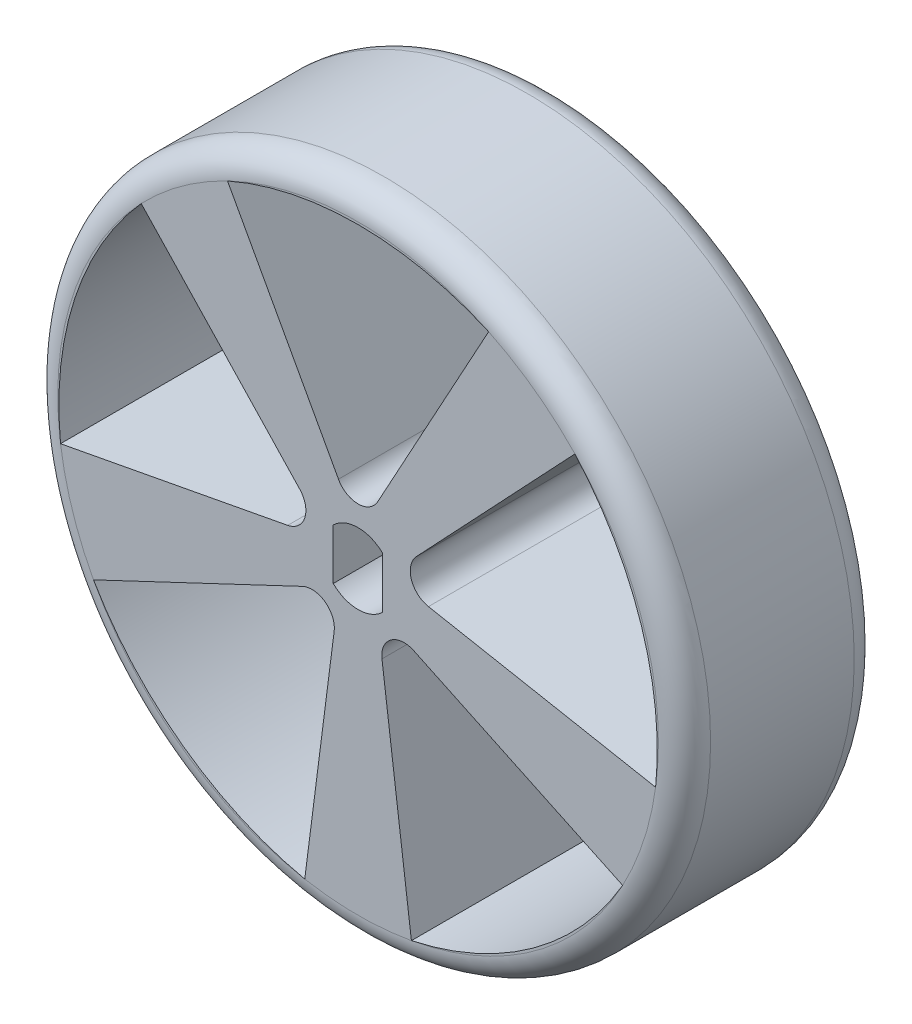
ISO-10303-21;
HEADER;
FILE_DESCRIPTION(('STEP AP214'),'2;1');
FILE_NAME('part.step','',(''),(''),'','','');
FILE_SCHEMA(('AUTOMOTIVE_DESIGN { 1 0 10303 214 1 1 1 1 }'));
ENDSEC;
DATA;
#1=APPLICATION_CONTEXT('core data for automotive mechanical design processes');
#2=APPLICATION_PROTOCOL_DEFINITION('international standard','automotive_design',2000,#1);
#3=PRODUCT_CONTEXT('',#1,'mechanical');
#4=PRODUCT('Part','Part','',(#3));
#5=PRODUCT_RELATED_PRODUCT_CATEGORY('part','',(#4));
#6=PRODUCT_DEFINITION_FORMATION('','',#4);
#7=PRODUCT_DEFINITION_CONTEXT('part definition',#1,'design');
#8=PRODUCT_DEFINITION('design','',#6,#7);
#9=PRODUCT_DEFINITION_SHAPE('','',#8);
#10=(LENGTH_UNIT() NAMED_UNIT(*) SI_UNIT(.MILLI.,.METRE.));
#11=(NAMED_UNIT(*) PLANE_ANGLE_UNIT() SI_UNIT($,.RADIAN.));
#12=(NAMED_UNIT(*) SI_UNIT($,.STERADIAN.) SOLID_ANGLE_UNIT());
#13=UNCERTAINTY_MEASURE_WITH_UNIT(LENGTH_MEASURE(1.E-05),#10,'distance_accuracy_value','');
#14=(GEOMETRIC_REPRESENTATION_CONTEXT(3) GLOBAL_UNCERTAINTY_ASSIGNED_CONTEXT((#13)) GLOBAL_UNIT_ASSIGNED_CONTEXT((#10,
#11,#12)) REPRESENTATION_CONTEXT('',''));
#15=CARTESIAN_POINT('',(0.,0.,0.));
#16=DIRECTION('',(0.,0.,1.));
#17=DIRECTION('',(1.,0.,0.));
#18=AXIS2_PLACEMENT_3D('',#15,#16,#17);
#19=CARTESIAN_POINT('',(0.,0.,15.));
#20=DIRECTION('',(0.,0.,1.));
#21=DIRECTION('',(1.,0.,0.));
#22=AXIS2_PLACEMENT_3D('',#19,#20,#21);
#23=PLANE('',#22);
#24=CARTESIAN_POINT('',(-5.7063390977709,1.85410196624975,15.));
#25=DIRECTION('',(0.,0.,1.));
#26=DIRECTION('',(1.,0.,0.));
#27=AXIS2_PLACEMENT_3D('',#24,#25,#26);
#28=CIRCLE('',#27,1.70989903384245);
#29=CARTESIAN_POINT('',(-4.46216204722803,3.0270376732848,15.));
#30=VERTEX_POINT('',#29);
#31=CARTESIAN_POINT('',(-5.38921303035291,0.173868124399349,15.));
#32=VERTEX_POINT('',#31);
#33=EDGE_CURVE('E866',#30,#32,#28,.F.);
#34=ORIENTED_EDGE('',*,*,#33,.T.);
#35=DIRECTION('',(-0.982650910138601,-0.185464791277969,0.));
#36=VECTOR('',#35,1.);
#37=CARTESIAN_POINT('',(-5.38921303035291,0.173868124399349,15.));
#38=LINE('',#37,#36);
#39=CARTESIAN_POINT('',(-22.7887522605922,-3.11010778034386,15.));
#40=VERTEX_POINT('',#39);
#41=EDGE_CURVE('E516',#32,#40,#38,.T.);
#42=ORIENTED_EDGE('',*,*,#41,.T.);
#43=CARTESIAN_POINT('',(0.,0.,15.));
#44=DIRECTION('',(0.,0.,1.));
#45=DIRECTION('',(1.,0.,0.));
#46=AXIS2_PLACEMENT_3D('',#43,#44,#45);
#47=CIRCLE('',#46,23.);
#48=CARTESIAN_POINT('',(-20.2645633457459,-10.8787624482866,15.));
#49=VERTEX_POINT('',#48);
#50=EDGE_CURVE('E281',#40,#49,#47,.T.);
#51=ORIENTED_EDGE('',*,*,#50,.T.);
#52=DIRECTION('',(-0.903994754972837,-0.427543545129148,0.));
#53=VECTOR('',#52,1.);
#54=CARTESIAN_POINT('',(-4.25776780849679,-3.30836220812295,15.));
#55=LINE('',#54,#53);
#56=CARTESIAN_POINT('',(-4.25776780849679,-3.30836220812295,15.));
#57=VERTEX_POINT('',#56);
#58=EDGE_CURVE('E515',#57,#49,#55,.T.);
#59=ORIENTED_EDGE('',*,*,#58,.F.);
#60=CARTESIAN_POINT('',(-3.52671151375488,-4.85410196624965,15.));
#61=DIRECTION('',(0.,0.,1.));
#62=DIRECTION('',(1.,0.,0.));
#63=AXIS2_PLACEMENT_3D('',#60,#61,#62);
#64=CIRCLE('',#63,1.70989903384245);
#65=CARTESIAN_POINT('',(-1.83071682537196,-5.07171796500039,15.));
#66=VERTEX_POINT('',#65);
#67=EDGE_CURVE('E939',#57,#66,#64,.F.);
#68=ORIENTED_EDGE('',*,*,#67,.T.);
#69=DIRECTION('',(-0.127268332482602,-0.991868323693775,0.));
#70=VECTOR('',#69,1.);
#71=CARTESIAN_POINT('',(-1.83071682537196,-5.07171796500039,15.));
#72=LINE('',#71,#70);
#73=CARTESIAN_POINT('',(-4.08422345824714,-22.6344674941361,15.));
#74=VERTEX_POINT('',#73);
#75=EDGE_CURVE('E259',#66,#74,#72,.T.);
#76=ORIENTED_EDGE('',*,*,#75,.T.);
#77=CARTESIAN_POINT('',(4.08422345824688,-22.6344674941361,15.));
#78=VERTEX_POINT('',#77);
#79=EDGE_CURVE('E267',#74,#78,#47,.T.);
#80=ORIENTED_EDGE('',*,*,#79,.T.);
#81=DIRECTION('',(0.127268332482587,-0.991868323693776,0.));
#82=VECTOR('',#81,1.);
#83=CARTESIAN_POINT('',(1.83071682537189,-5.07171796500042,15.));
#84=LINE('',#83,#82);
#85=CARTESIAN_POINT('',(1.83071682537189,-5.07171796500042,15.));
#86=VERTEX_POINT('',#85);
#87=EDGE_CURVE('E228',#86,#78,#84,.T.);
#88=ORIENTED_EDGE('',*,*,#87,.F.);
#89=CARTESIAN_POINT('',(3.52671151375481,-4.85410196624971,15.));
#90=DIRECTION('',(0.,0.,1.));
#91=DIRECTION('',(1.,0.,0.));
#92=AXIS2_PLACEMENT_3D('',#89,#90,#91);
#93=CIRCLE('',#92,1.70989903384245);
#94=CARTESIAN_POINT('',(4.25776780849674,-3.30836220812302,15.));
#95=VERTEX_POINT('',#94);
#96=EDGE_CURVE('E239',#86,#95,#93,.F.);
#97=ORIENTED_EDGE('',*,*,#96,.T.);
#98=DIRECTION('',(0.903994754972831,-0.427543545129161,0.));
#99=VECTOR('',#98,1.);
#100=CARTESIAN_POINT('',(4.25776780849674,-3.30836220812302,15.));
#101=LINE('',#100,#99);
#102=CARTESIAN_POINT('',(20.2645633457458,-10.8787624482868,15.));
#103=VERTEX_POINT('',#102);
#104=EDGE_CURVE('E886',#95,#103,#101,.T.);
#105=ORIENTED_EDGE('',*,*,#104,.T.);
#106=CARTESIAN_POINT('',(22.7887522605921,-3.11010778034412,15.));
#107=VERTEX_POINT('',#106);
#108=EDGE_CURVE('E271',#103,#107,#47,.T.);
#109=ORIENTED_EDGE('',*,*,#108,.T.);
#110=DIRECTION('',(0.982650910138598,-0.185464791277982,0.));
#111=VECTOR('',#110,1.);
#112=CARTESIAN_POINT('',(5.38921303035291,0.173868124399272,15.));
#113=LINE('',#112,#111);
#114=CARTESIAN_POINT('',(5.38921303035291,0.173868124399272,15.));
#115=VERTEX_POINT('',#114);
#116=EDGE_CURVE('E885',#115,#107,#113,.T.);
#117=ORIENTED_EDGE('',*,*,#116,.F.);
#118=CARTESIAN_POINT('',(5.70633909777093,1.85410196624967,15.));
#119=DIRECTION('',(0.,0.,1.));
#120=DIRECTION('',(1.,0.,0.));
#121=AXIS2_PLACEMENT_3D('',#118,#119,#120);
#122=CIRCLE('',#121,1.70989903384245);
#123=CARTESIAN_POINT('',(4.46216204722808,3.02703767328474,15.));
#124=VERTEX_POINT('',#123);
#125=EDGE_CURVE('E889',#115,#124,#122,.F.);
#126=ORIENTED_EDGE('',*,*,#125,.T.);
#127=DIRECTION('',(0.685967816707439,0.727631881133331,0.));
#128=VECTOR('',#127,1.);
#129=CARTESIAN_POINT('',(4.46216204722808,3.02703767328474,15.));
#130=LINE('',#129,#128);
#131=CARTESIAN_POINT('',(16.6084123730932,15.9110225455589,15.));
#132=VERTEX_POINT('',#131);
#133=EDGE_CURVE('E539',#124,#132,#130,.T.);
#134=ORIENTED_EDGE('',*,*,#133,.T.);
#135=CARTESIAN_POINT('',(9.99999999999993,20.712315177208,15.));
#136=VERTEX_POINT('',#135);
#137=EDGE_CURVE('E289',#132,#136,#47,.T.);
#138=ORIENTED_EDGE('',*,*,#137,.T.);
#139=DIRECTION('',(0.480043329059079,0.877244778967579,0.));
#140=VECTOR('',#139,1.);
#141=CARTESIAN_POINT('',(1.5,5.17917437543937,15.));
#142=LINE('',#141,#140);
#143=CARTESIAN_POINT('',(1.5,5.17917437543937,15.));
#144=VERTEX_POINT('',#143);
#145=EDGE_CURVE('E538',#144,#136,#142,.T.);
#146=ORIENTED_EDGE('',*,*,#145,.F.);
#147=CARTESIAN_POINT('',(0.,6.,15.));
#148=DIRECTION('',(0.,0.,1.));
#149=DIRECTION('',(1.,0.,0.));
#150=AXIS2_PLACEMENT_3D('',#147,#148,#149);
#151=CIRCLE('',#150,1.70989903384245);
#152=CARTESIAN_POINT('',(-1.5,5.17917437543937,15.));
#153=VERTEX_POINT('',#152);
#154=EDGE_CURVE('E544',#144,#153,#151,.F.);
#155=ORIENTED_EDGE('',*,*,#154,.T.);
#156=DIRECTION('',(-0.480043329059079,0.877244778967579,0.));
#157=VECTOR('',#156,1.);
#158=CARTESIAN_POINT('',(-1.5,5.17917437543937,15.));
#159=LINE('',#158,#157);
#160=CARTESIAN_POINT('',(-10.,20.712315177208,15.));
#161=VERTEX_POINT('',#160);
#162=EDGE_CURVE('E383',#153,#161,#159,.T.);
#163=ORIENTED_EDGE('',*,*,#162,.T.);
#164=CARTESIAN_POINT('',(-16.6084123730931,15.9110225455591,15.));
#165=VERTEX_POINT('',#164);
#166=EDGE_CURVE('E288',#161,#165,#47,.T.);
#167=ORIENTED_EDGE('',*,*,#166,.T.);
#168=DIRECTION('',(-0.685967816707429,0.72763188113334,0.));
#169=VECTOR('',#168,1.);
#170=CARTESIAN_POINT('',(-4.46216204722803,3.0270376732848,15.));
#171=LINE('',#170,#169);
#172=EDGE_CURVE('E532',#30,#165,#171,.T.);
#173=ORIENTED_EDGE('',*,*,#172,.F.);
#174=EDGE_LOOP('',(#34,#42,#51,#59,#68,#76,#80,#88,#97,#105,#109,#117,#126,#134,#138,#146,#155,
#163,#167,#173));
#175=FACE_BOUND('',#174,.T.);
#176=CARTESIAN_POINT('',(0.,0.,15.));
#177=DIRECTION('',(0.,0.,1.));
#178=DIRECTION('',(1.,0.,0.));
#179=AXIS2_PLACEMENT_3D('',#176,#177,#178);
#180=CIRCLE('',#179,2.71839690218096);
#181=CARTESIAN_POINT('',(1.85911077182623,1.98327730180798,15.));
#182=VERTEX_POINT('',#181);
#183=CARTESIAN_POINT('',(-1.90296984791011,1.94123349335727,15.));
#184=VERTEX_POINT('',#183);
#185=EDGE_CURVE('E417',#182,#184,#180,.T.);
#186=ORIENTED_EDGE('',*,*,#185,.F.);
#187=DIRECTION('',(0.,1.,0.));
#188=VECTOR('',#187,1.);
#189=CARTESIAN_POINT('',(1.85911077182623,1.98327730180798,15.));
#190=LINE('',#189,#188);
#191=CARTESIAN_POINT('',(1.85911077182623,-1.98327730180798,15.));
#192=VERTEX_POINT('',#191);
#193=EDGE_CURVE('E405',#192,#182,#190,.T.);
#194=ORIENTED_EDGE('',*,*,#193,.F.);
#195=CARTESIAN_POINT('',(0.,0.,15.));
#196=DIRECTION('',(0.,0.,1.));
#197=DIRECTION('',(1.,0.,0.));
#198=AXIS2_PLACEMENT_3D('',#195,#196,#197);
#199=CIRCLE('',#198,2.71839690218096);
#200=CARTESIAN_POINT('',(-1.90296984791011,-1.94123349335727,15.));
#201=VERTEX_POINT('',#200);
#202=EDGE_CURVE('E424',#201,#192,#199,.T.);
#203=ORIENTED_EDGE('',*,*,#202,.F.);
#204=DIRECTION('',(0.,-1.,0.));
#205=VECTOR('',#204,1.);
#206=CARTESIAN_POINT('',(-1.90296984791011,1.94123349335727,15.));
#207=LINE('',#206,#205);
#208=EDGE_CURVE('E420',#184,#201,#207,.T.);
#209=ORIENTED_EDGE('',*,*,#208,.F.);
#210=EDGE_LOOP('',(#186,#194,#203,#209));
#211=FACE_BOUND('',#210,.T.);
#212=ADVANCED_FACE('F62',(#175,#211),#23,.T.);
#213=CARTESIAN_POINT('',(1.84358467597893,-0.599016972898737,15.));
#214=DIRECTION('',(0.,0.,1.));
#215=DIRECTION('',(1.,0.,0.));
#216=AXIS2_PLACEMENT_3D('',#213,#214,#215);
#217=CIRCLE('',#216,24.76);
#218=EDGE_CURVE('E969',#40,#165,#217,.F.);
#219=ORIENTED_EDGE('',*,*,#218,.T.);
#220=EDGE_CURVE('E525',#165,#40,#47,.T.);
#221=ORIENTED_EDGE('',*,*,#220,.T.);
#222=EDGE_LOOP('',(#219,#221));
#223=FACE_BOUND('',#222,.T.);
#224=ADVANCED_FACE('F469',(#223),#23,.T.);
#225=CARTESIAN_POINT('',(1.13939799089346,1.5682467948869,15.));
#226=DIRECTION('',(0.,0.,1.));
#227=DIRECTION('',(1.,0.,0.));
#228=AXIS2_PLACEMENT_3D('',#225,#226,#227);
#229=CIRCLE('',#228,24.76);
#230=EDGE_CURVE('E511',#74,#49,#229,.F.);
#231=ORIENTED_EDGE('',*,*,#230,.T.);
#232=EDGE_CURVE('E279',#49,#74,#47,.T.);
#233=ORIENTED_EDGE('',*,*,#232,.T.);
#234=EDGE_LOOP('',(#231,#233));
#235=FACE_BOUND('',#234,.T.);
#236=ADVANCED_FACE('F475',(#235),#23,.T.);
#237=CARTESIAN_POINT('',(-1.13939799089343,1.56824679488692,15.));
#238=DIRECTION('',(0.,0.,1.));
#239=DIRECTION('',(1.,0.,0.));
#240=AXIS2_PLACEMENT_3D('',#237,#238,#239);
#241=CIRCLE('',#240,24.76);
#242=EDGE_CURVE('E240',#103,#78,#241,.F.);
#243=ORIENTED_EDGE('',*,*,#242,.T.);
#244=EDGE_CURVE('E257',#78,#103,#47,.T.);
#245=ORIENTED_EDGE('',*,*,#244,.T.);
#246=EDGE_LOOP('',(#243,#245));
#247=FACE_BOUND('',#246,.T.);
#248=ADVANCED_FACE('F256',(#247),#23,.T.);
#249=CARTESIAN_POINT('',(0.,0.,0.));
#250=DIRECTION('',(0.,0.,1.));
#251=DIRECTION('',(1.,0.,0.));
#252=AXIS2_PLACEMENT_3D('',#249,#250,#251);
#253=PLANE('',#252);
#254=CARTESIAN_POINT('',(0.,0.,0.));
#255=DIRECTION('',(0.,0.,1.));
#256=DIRECTION('',(1.,0.,0.));
#257=AXIS2_PLACEMENT_3D('',#254,#255,#256);
#258=CIRCLE('',#257,1.03999999999999);
#259=CARTESIAN_POINT('',(1.03999999999999,0.,0.));
#260=VERTEX_POINT('',#259);
#261=EDGE_CURVE('E396',#260,#260,#258,.T.);
#262=ORIENTED_EDGE('',*,*,#261,.T.);
#263=EDGE_LOOP('',(#262));
#264=FACE_BOUND('',#263,.T.);
#265=DIRECTION('',(-0.9826509101386,-0.185464791277969,0.));
#266=VECTOR('',#265,1.);
#267=CARTESIAN_POINT('',(-5.38921303035291,0.173868124399349,0.));
#268=LINE('',#267,#266);
#269=CARTESIAN_POINT('',(-5.38921303035291,0.173868124399349,0.));
#270=VERTEX_POINT('',#269);
#271=CARTESIAN_POINT('',(-22.7887522605922,-3.11010778034386,0.));
#272=VERTEX_POINT('',#271);
#273=EDGE_CURVE('E854',#270,#272,#268,.T.);
#274=ORIENTED_EDGE('',*,*,#273,.F.);
#275=CARTESIAN_POINT('',(-5.7063390977709,1.85410196624975,0.));
#276=DIRECTION('',(0.,0.,-1.));
#277=DIRECTION('',(-0.309016994374958,-0.95105651629515,0.));
#278=AXIS2_PLACEMENT_3D('',#275,#276,#277);
#279=CIRCLE('',#278,1.70989903384245);
#280=CARTESIAN_POINT('',(-4.46216204722803,3.0270376732848,0.));
#281=VERTEX_POINT('',#280);
#282=EDGE_CURVE('E80',#281,#270,#279,.T.);
#283=ORIENTED_EDGE('',*,*,#282,.F.);
#284=DIRECTION('',(-0.685967816707429,0.72763188113334,0.));
#285=VECTOR('',#284,1.);
#286=CARTESIAN_POINT('',(-4.46216204722803,3.0270376732848,0.));
#287=LINE('',#286,#285);
#288=CARTESIAN_POINT('',(-16.608412373093,15.9110225455591,0.));
#289=VERTEX_POINT('',#288);
#290=EDGE_CURVE('E857',#281,#289,#287,.T.);
#291=ORIENTED_EDGE('',*,*,#290,.T.);
#292=CARTESIAN_POINT('',(0.,0.,0.));
#293=DIRECTION('',(0.,0.,1.));
#294=DIRECTION('',(1.,0.,0.));
#295=AXIS2_PLACEMENT_3D('',#292,#293,#294);
#296=CIRCLE('',#295,23.);
#297=CARTESIAN_POINT('',(-10.,20.712315177208,0.));
#298=VERTEX_POINT('',#297);
#299=EDGE_CURVE('E73',#289,#298,#296,.F.);
#300=ORIENTED_EDGE('',*,*,#299,.T.);
#301=DIRECTION('',(-0.480043329059079,0.877244778967579,0.));
#302=VECTOR('',#301,1.);
#303=CARTESIAN_POINT('',(-1.5,5.17917437543937,0.));
#304=LINE('',#303,#302);
#305=CARTESIAN_POINT('',(-1.5,5.17917437543937,0.));
#306=VERTEX_POINT('',#305);
#307=EDGE_CURVE('E369',#306,#298,#304,.T.);
#308=ORIENTED_EDGE('',*,*,#307,.F.);
#309=CARTESIAN_POINT('',(0.,6.,0.));
#310=DIRECTION('',(0.,0.,-1.));
#311=DIRECTION('',(-1.,0.,0.));
#312=AXIS2_PLACEMENT_3D('',#309,#310,#311);
#313=CIRCLE('',#312,1.70989903384245);
#314=CARTESIAN_POINT('',(1.5,5.17917437543937,0.));
#315=VERTEX_POINT('',#314);
#316=EDGE_CURVE('E376',#315,#306,#313,.T.);
#317=ORIENTED_EDGE('',*,*,#316,.F.);
#318=DIRECTION('',(0.480043329059079,0.877244778967579,0.));
#319=VECTOR('',#318,1.);
#320=CARTESIAN_POINT('',(1.5,5.17917437543937,0.));
#321=LINE('',#320,#319);
#322=CARTESIAN_POINT('',(10.,20.712315177208,0.));
#323=VERTEX_POINT('',#322);
#324=EDGE_CURVE('E357',#315,#323,#321,.T.);
#325=ORIENTED_EDGE('',*,*,#324,.T.);
#326=CARTESIAN_POINT('',(16.6084123730932,15.9110225455589,0.));
#327=VERTEX_POINT('',#326);
#328=EDGE_CURVE('E72',#323,#327,#296,.F.);
#329=ORIENTED_EDGE('',*,*,#328,.T.);
#330=DIRECTION('',(0.685967816707439,0.727631881133331,0.));
#331=VECTOR('',#330,1.);
#332=CARTESIAN_POINT('',(4.46216204722808,3.02703767328474,0.));
#333=LINE('',#332,#331);
#334=CARTESIAN_POINT('',(4.46216204722808,3.02703767328474,0.));
#335=VERTEX_POINT('',#334);
#336=EDGE_CURVE('E354',#335,#327,#333,.T.);
#337=ORIENTED_EDGE('',*,*,#336,.F.);
#338=CARTESIAN_POINT('',(5.70633909777093,1.85410196624967,0.));
#339=DIRECTION('',(0.,0.,-1.));
#340=DIRECTION('',(-0.309016994374945,0.951056516295155,0.));
#341=AXIS2_PLACEMENT_3D('',#338,#339,#340);
#342=CIRCLE('',#341,1.70989903384245);
#343=CARTESIAN_POINT('',(5.38921303035291,0.173868124399272,0.));
#344=VERTEX_POINT('',#343);
#345=EDGE_CURVE('E893',#344,#335,#342,.T.);
#346=ORIENTED_EDGE('',*,*,#345,.F.);
#347=DIRECTION('',(0.982650910138598,-0.185464791277982,0.));
#348=VECTOR('',#347,1.);
#349=CARTESIAN_POINT('',(5.38921303035291,0.173868124399272,0.));
#350=LINE('',#349,#348);
#351=CARTESIAN_POINT('',(22.7887522605921,-3.11010778034419,0.));
#352=VERTEX_POINT('',#351);
#353=EDGE_CURVE('E902',#344,#352,#350,.T.);
#354=ORIENTED_EDGE('',*,*,#353,.T.);
#355=CARTESIAN_POINT('',(20.2645633457458,-10.8787624482868,0.));
#356=VERTEX_POINT('',#355);
#357=EDGE_CURVE('E332',#352,#356,#296,.F.);
#358=ORIENTED_EDGE('',*,*,#357,.T.);
#359=DIRECTION('',(0.903994754972831,-0.427543545129161,0.));
#360=VECTOR('',#359,1.);
#361=CARTESIAN_POINT('',(4.25776780849674,-3.30836220812302,0.));
#362=LINE('',#361,#360);
#363=CARTESIAN_POINT('',(4.25776780849674,-3.30836220812302,0.));
#364=VERTEX_POINT('',#363);
#365=EDGE_CURVE('E983',#364,#356,#362,.T.);
#366=ORIENTED_EDGE('',*,*,#365,.F.);
#367=CARTESIAN_POINT('',(3.52671151375481,-4.85410196624971,0.));
#368=DIRECTION('',(0.,0.,-1.));
#369=DIRECTION('',(0.809016994374951,0.587785252292469,0.));
#370=AXIS2_PLACEMENT_3D('',#367,#368,#369);
#371=CIRCLE('',#370,1.70989903384245);
#372=CARTESIAN_POINT('',(1.83071682537189,-5.07171796500042,0.));
#373=VERTEX_POINT('',#372);
#374=EDGE_CURVE('E980',#373,#364,#371,.T.);
#375=ORIENTED_EDGE('',*,*,#374,.F.);
#376=DIRECTION('',(0.127268332482587,-0.991868323693776,0.));
#377=VECTOR('',#376,1.);
#378=CARTESIAN_POINT('',(1.83071682537189,-5.07171796500042,0.));
#379=LINE('',#378,#377);
#380=CARTESIAN_POINT('',(4.08422345824681,-22.6344674941362,0.));
#381=VERTEX_POINT('',#380);
#382=EDGE_CURVE('E989',#373,#381,#379,.T.);
#383=ORIENTED_EDGE('',*,*,#382,.T.);
#384=CARTESIAN_POINT('',(-4.08422345824714,-22.6344674941361,0.));
#385=VERTEX_POINT('',#384);
#386=EDGE_CURVE('E321',#381,#385,#296,.F.);
#387=ORIENTED_EDGE('',*,*,#386,.T.);
#388=DIRECTION('',(-0.127268332482602,-0.991868323693774,0.));
#389=VECTOR('',#388,1.);
#390=CARTESIAN_POINT('',(-1.83071682537196,-5.07171796500039,0.));
#391=LINE('',#390,#389);
#392=CARTESIAN_POINT('',(-1.83071682537196,-5.07171796500039,0.));
#393=VERTEX_POINT('',#392);
#394=EDGE_CURVE('E944',#393,#385,#391,.T.);
#395=ORIENTED_EDGE('',*,*,#394,.F.);
#396=CARTESIAN_POINT('',(-3.52671151375488,-4.85410196624965,0.));
#397=DIRECTION('',(0.,0.,-1.));
#398=DIRECTION('',(0.809016994374942,-0.58778525229248,0.));
#399=AXIS2_PLACEMENT_3D('',#396,#397,#398);
#400=CIRCLE('',#399,1.70989903384245);
#401=CARTESIAN_POINT('',(-4.25776780849679,-3.30836220812295,0.));
#402=VERTEX_POINT('',#401);
#403=EDGE_CURVE('E88',#402,#393,#400,.T.);
#404=ORIENTED_EDGE('',*,*,#403,.F.);
#405=DIRECTION('',(-0.903994754972837,-0.427543545129148,0.));
#406=VECTOR('',#405,1.);
#407=CARTESIAN_POINT('',(-4.25776780849679,-3.30836220812295,0.));
#408=LINE('',#407,#406);
#409=CARTESIAN_POINT('',(-20.264563345746,-10.8787624482865,0.));
#410=VERTEX_POINT('',#409);
#411=EDGE_CURVE('E952',#402,#410,#408,.T.);
#412=ORIENTED_EDGE('',*,*,#411,.T.);
#413=EDGE_CURVE('E309',#410,#272,#296,.F.);
#414=ORIENTED_EDGE('',*,*,#413,.T.);
#415=EDGE_LOOP('',(#274,#283,#291,#300,#308,#317,#325,#329,#337,#346,#354,#358,#366,#375,#383,
#387,#395,#404,#412,#414));
#416=FACE_BOUND('',#415,.T.);
#417=ADVANCED_FACE('F351',(#264,#416),#253,.F.);
#418=EDGE_CURVE('E301',#272,#289,#296,.F.);
#419=ORIENTED_EDGE('',*,*,#418,.T.);
#420=CARTESIAN_POINT('',(1.84358467597893,-0.599016972898737,0.));
#421=DIRECTION('',(0.,0.,-1.));
#422=DIRECTION('',(-0.309016994374958,-0.95105651629515,0.));
#423=AXIS2_PLACEMENT_3D('',#420,#421,#422);
#424=CIRCLE('',#423,24.76);
#425=EDGE_CURVE('E860',#272,#289,#424,.T.);
#426=ORIENTED_EDGE('',*,*,#425,.F.);
#427=EDGE_LOOP('',(#419,#426));
#428=FACE_BOUND('',#427,.T.);
#429=ADVANCED_FACE('F502',(#428),#253,.F.);
#430=EDGE_CURVE('E315',#385,#410,#296,.F.);
#431=ORIENTED_EDGE('',*,*,#430,.T.);
#432=CARTESIAN_POINT('',(1.13939799089346,1.5682467948869,0.));
#433=DIRECTION('',(0.,0.,-1.));
#434=DIRECTION('',(0.809016994374942,-0.58778525229248,0.));
#435=AXIS2_PLACEMENT_3D('',#432,#433,#434);
#436=CIRCLE('',#435,24.76);
#437=EDGE_CURVE('E948',#385,#410,#436,.T.);
#438=ORIENTED_EDGE('',*,*,#437,.F.);
#439=EDGE_LOOP('',(#431,#438));
#440=FACE_BOUND('',#439,.T.);
#441=ADVANCED_FACE('F497',(#440),#253,.F.);
#442=EDGE_CURVE('E327',#356,#381,#296,.F.);
#443=ORIENTED_EDGE('',*,*,#442,.T.);
#444=CARTESIAN_POINT('',(-1.13939799089343,1.56824679488692,0.));
#445=DIRECTION('',(0.,0.,-1.));
#446=DIRECTION('',(0.809016994374951,0.587785252292469,0.));
#447=AXIS2_PLACEMENT_3D('',#444,#445,#446);
#448=CIRCLE('',#447,24.76);
#449=EDGE_CURVE('E248',#356,#381,#448,.T.);
#450=ORIENTED_EDGE('',*,*,#449,.F.);
#451=EDGE_LOOP('',(#443,#450));
#452=FACE_BOUND('',#451,.T.);
#453=ADVANCED_FACE('F491',(#452),#253,.F.);
#454=CARTESIAN_POINT('',(-1.84358467597893,-0.599016972898711,15.));
#455=DIRECTION('',(0.,0.,1.));
#456=DIRECTION('',(1.,0.,0.));
#457=AXIS2_PLACEMENT_3D('',#454,#455,#456);
#458=CIRCLE('',#457,24.76);
#459=EDGE_CURVE('E882',#132,#107,#458,.F.);
#460=ORIENTED_EDGE('',*,*,#459,.T.);
#461=EDGE_CURVE('E922',#107,#132,#47,.T.);
#462=ORIENTED_EDGE('',*,*,#461,.T.);
#463=EDGE_LOOP('',(#460,#462));
#464=FACE_BOUND('',#463,.T.);
#465=ADVANCED_FACE('F481',(#464),#23,.T.);
#466=EDGE_CURVE('E337',#327,#352,#296,.F.);
#467=ORIENTED_EDGE('',*,*,#466,.T.);
#468=CARTESIAN_POINT('',(-1.84358467597893,-0.599016972898711,0.));
#469=DIRECTION('',(0.,0.,-1.));
#470=DIRECTION('',(-0.309016994374945,0.951056516295155,0.));
#471=AXIS2_PLACEMENT_3D('',#468,#469,#470);
#472=CIRCLE('',#471,24.76);
#473=EDGE_CURVE('E898',#327,#352,#472,.T.);
#474=ORIENTED_EDGE('',*,*,#473,.F.);
#475=EDGE_LOOP('',(#467,#474));
#476=FACE_BOUND('',#475,.T.);
#477=ADVANCED_FACE('F486',(#476),#253,.F.);
#478=CARTESIAN_POINT('',(0.,0.,15.));
#479=DIRECTION('',(0.,0.,-1.));
#480=DIRECTION('',(-1.,0.,0.));
#481=AXIS2_PLACEMENT_3D('',#478,#479,#480);
#482=CYLINDRICAL_SURFACE('',#481,25.);
#483=CARTESIAN_POINT('',(0.,0.,13.));
#484=DIRECTION('',(0.,0.,1.));
#485=DIRECTION('',(1.,0.,0.));
#486=AXIS2_PLACEMENT_3D('',#483,#484,#485);
#487=CIRCLE('',#486,25.);
#488=CARTESIAN_POINT('',(25.,0.,13.));
#489=VERTEX_POINT('',#488);
#490=EDGE_CURVE('E295',#489,#489,#487,.F.);
#491=ORIENTED_EDGE('',*,*,#490,.T.);
#492=EDGE_LOOP('',(#491));
#493=FACE_BOUND('',#492,.T.);
#494=CARTESIAN_POINT('',(0.,0.,2.));
#495=DIRECTION('',(0.,0.,1.));
#496=DIRECTION('',(1.,0.,0.));
#497=AXIS2_PLACEMENT_3D('',#494,#495,#496);
#498=CIRCLE('',#497,25.);
#499=CARTESIAN_POINT('',(25.,0.,2.));
#500=VERTEX_POINT('',#499);
#501=EDGE_CURVE('E287',#500,#500,#498,.T.);
#502=ORIENTED_EDGE('',*,*,#501,.T.);
#503=EDGE_LOOP('',(#502));
#504=FACE_BOUND('',#503,.T.);
#505=ADVANCED_FACE('F479',(#493,#504),#482,.T.);
#506=CARTESIAN_POINT('',(0.,-1.93845964397639,15.));
#507=DIRECTION('',(0.,0.,1.));
#508=DIRECTION('',(1.,0.,0.));
#509=AXIS2_PLACEMENT_3D('',#506,#507,#508);
#510=CIRCLE('',#509,24.76);
#511=EDGE_CURVE('E536',#161,#136,#510,.F.);
#512=ORIENTED_EDGE('',*,*,#511,.T.);
#513=EDGE_CURVE('E282',#136,#161,#47,.T.);
#514=ORIENTED_EDGE('',*,*,#513,.T.);
#515=EDGE_LOOP('',(#512,#514));
#516=FACE_BOUND('',#515,.T.);
#517=ADVANCED_FACE('F470',(#516),#23,.T.);
#518=EDGE_CURVE('E11',#298,#323,#296,.F.);
#519=ORIENTED_EDGE('',*,*,#518,.T.);
#520=CARTESIAN_POINT('',(0.,-1.93845964397639,0.));
#521=DIRECTION('',(0.,0.,-1.));
#522=DIRECTION('',(-1.,0.,0.));
#523=AXIS2_PLACEMENT_3D('',#520,#521,#522);
#524=CIRCLE('',#523,24.76);
#525=EDGE_CURVE('E365',#298,#323,#524,.T.);
#526=ORIENTED_EDGE('',*,*,#525,.F.);
#527=EDGE_LOOP('',(#519,#526));
#528=FACE_BOUND('',#527,.T.);
#529=ADVANCED_FACE('F363',(#528),#253,.F.);
#530=CARTESIAN_POINT('',(0.,0.,13.));
#531=DIRECTION('',(0.,0.,1.));
#532=DIRECTION('',(1.,0.,0.));
#533=AXIS2_PLACEMENT_3D('',#530,#531,#532);
#534=TOROIDAL_SURFACE('',#533,23.,2.);
#535=ORIENTED_EDGE('',*,*,#490,.F.);
#536=EDGE_LOOP('',(#535));
#537=FACE_BOUND('',#536,.T.);
#538=ORIENTED_EDGE('',*,*,#513,.F.);
#539=ORIENTED_EDGE('',*,*,#137,.F.);
#540=ORIENTED_EDGE('',*,*,#461,.F.);
#541=ORIENTED_EDGE('',*,*,#108,.F.);
#542=ORIENTED_EDGE('',*,*,#244,.F.);
#543=ORIENTED_EDGE('',*,*,#79,.F.);
#544=ORIENTED_EDGE('',*,*,#232,.F.);
#545=ORIENTED_EDGE('',*,*,#50,.F.);
#546=ORIENTED_EDGE('',*,*,#220,.F.);
#547=ORIENTED_EDGE('',*,*,#166,.F.);
#548=EDGE_LOOP('',(#538,#539,#540,#541,#542,#543,#544,#545,#546,#547));
#549=FACE_BOUND('',#548,.T.);
#550=ADVANCED_FACE('F265',(#537,#549),#534,.T.);
#551=CARTESIAN_POINT('',(0.,0.,2.));
#552=DIRECTION('',(0.,0.,1.));
#553=DIRECTION('',(1.,0.,0.));
#554=AXIS2_PLACEMENT_3D('',#551,#552,#553);
#555=TOROIDAL_SURFACE('',#554,23.,2.);
#556=ORIENTED_EDGE('',*,*,#518,.F.);
#557=ORIENTED_EDGE('',*,*,#299,.F.);
#558=ORIENTED_EDGE('',*,*,#418,.F.);
#559=ORIENTED_EDGE('',*,*,#413,.F.);
#560=ORIENTED_EDGE('',*,*,#430,.F.);
#561=ORIENTED_EDGE('',*,*,#386,.F.);
#562=ORIENTED_EDGE('',*,*,#442,.F.);
#563=ORIENTED_EDGE('',*,*,#357,.F.);
#564=ORIENTED_EDGE('',*,*,#466,.F.);
#565=ORIENTED_EDGE('',*,*,#328,.F.);
#566=EDGE_LOOP('',(#556,#557,#558,#559,#560,#561,#562,#563,#564,#565));
#567=FACE_BOUND('',#566,.T.);
#568=ORIENTED_EDGE('',*,*,#501,.F.);
#569=EDGE_LOOP('',(#568));
#570=FACE_BOUND('',#569,.T.);
#571=ADVANCED_FACE('F64',(#567,#570),#555,.T.);
#572=CARTESIAN_POINT('',(0.,0.,11.));
#573=DIRECTION('',(0.,0.,1.));
#574=DIRECTION('',(1.,0.,0.));
#575=AXIS2_PLACEMENT_3D('',#572,#573,#574);
#576=CYLINDRICAL_SURFACE('',#575,2.71839690218096);
#577=ORIENTED_EDGE('',*,*,#185,.T.);
#578=DIRECTION('',(0.,0.,1.));
#579=VECTOR('',#578,1.);
#580=CARTESIAN_POINT('',(-1.90296984791011,1.94123349335727,11.));
#581=LINE('',#580,#579);
#582=CARTESIAN_POINT('',(-1.90296984791011,1.94123349335727,11.));
#583=VERTEX_POINT('',#582);
#584=EDGE_CURVE('E290',#583,#184,#581,.T.);
#585=ORIENTED_EDGE('',*,*,#584,.F.);
#586=CARTESIAN_POINT('',(0.,0.,11.));
#587=DIRECTION('',(0.,0.,1.));
#588=DIRECTION('',(1.,0.,0.));
#589=AXIS2_PLACEMENT_3D('',#586,#587,#588);
#590=CIRCLE('',#589,2.71839690218096);
#591=CARTESIAN_POINT('',(1.85911077182623,1.98327730180798,11.));
#592=VERTEX_POINT('',#591);
#593=EDGE_CURVE('E400',#592,#583,#590,.T.);
#594=ORIENTED_EDGE('',*,*,#593,.F.);
#595=DIRECTION('',(0.,0.,1.));
#596=VECTOR('',#595,1.);
#597=CARTESIAN_POINT('',(1.85911077182623,1.98327730180798,11.));
#598=LINE('',#597,#596);
#599=EDGE_CURVE('E431',#592,#182,#598,.T.);
#600=ORIENTED_EDGE('',*,*,#599,.T.);
#601=EDGE_LOOP('',(#577,#585,#594,#600));
#602=FACE_BOUND('',#601,.T.);
#603=ADVANCED_FACE('F457',(#602),#576,.F.);
#604=CARTESIAN_POINT('',(1.85911077182623,1.98327730180798,11.));
#605=DIRECTION('',(1.,0.,0.));
#606=DIRECTION('',(0.,1.,0.));
#607=AXIS2_PLACEMENT_3D('',#604,#605,#606);
#608=PLANE('',#607);
#609=ORIENTED_EDGE('',*,*,#193,.T.);
#610=ORIENTED_EDGE('',*,*,#599,.F.);
#611=DIRECTION('',(0.,1.,0.));
#612=VECTOR('',#611,1.);
#613=CARTESIAN_POINT('',(1.85911077182623,1.98327730180798,11.));
#614=LINE('',#613,#612);
#615=CARTESIAN_POINT('',(1.85911077182623,-1.98327730180798,11.));
#616=VERTEX_POINT('',#615);
#617=EDGE_CURVE('E413',#616,#592,#614,.T.);
#618=ORIENTED_EDGE('',*,*,#617,.F.);
#619=DIRECTION('',(0.,0.,1.));
#620=VECTOR('',#619,1.);
#621=CARTESIAN_POINT('',(1.85911077182623,-1.98327730180798,11.));
#622=LINE('',#621,#620);
#623=EDGE_CURVE('E434',#616,#192,#622,.T.);
#624=ORIENTED_EDGE('',*,*,#623,.T.);
#625=EDGE_LOOP('',(#609,#610,#618,#624));
#626=FACE_BOUND('',#625,.T.);
#627=ADVANCED_FACE('F456',(#626),#608,.F.);
#628=CARTESIAN_POINT('',(0.,0.,11.));
#629=DIRECTION('',(0.,0.,1.));
#630=DIRECTION('',(1.,0.,0.));
#631=AXIS2_PLACEMENT_3D('',#628,#629,#630);
#632=CYLINDRICAL_SURFACE('',#631,2.71839690218096);
#633=ORIENTED_EDGE('',*,*,#202,.T.);
#634=ORIENTED_EDGE('',*,*,#623,.F.);
#635=CARTESIAN_POINT('',(0.,0.,11.));
#636=DIRECTION('',(0.,0.,1.));
#637=DIRECTION('',(1.,0.,0.));
#638=AXIS2_PLACEMENT_3D('',#635,#636,#637);
#639=CIRCLE('',#638,2.71839690218096);
#640=CARTESIAN_POINT('',(-1.90296984791011,-1.94123349335727,11.));
#641=VERTEX_POINT('',#640);
#642=EDGE_CURVE('E409',#641,#616,#639,.T.);
#643=ORIENTED_EDGE('',*,*,#642,.F.);
#644=DIRECTION('',(0.,0.,1.));
#645=VECTOR('',#644,1.);
#646=CARTESIAN_POINT('',(-1.90296984791011,-1.94123349335727,11.));
#647=LINE('',#646,#645);
#648=EDGE_CURVE('E436',#641,#201,#647,.T.);
#649=ORIENTED_EDGE('',*,*,#648,.T.);
#650=EDGE_LOOP('',(#633,#634,#643,#649));
#651=FACE_BOUND('',#650,.T.);
#652=ADVANCED_FACE('F451',(#651),#632,.F.);
#653=CARTESIAN_POINT('',(-1.90296984791011,1.94123349335727,11.));
#654=DIRECTION('',(-1.,0.,0.));
#655=DIRECTION('',(0.,0.,1.));
#656=AXIS2_PLACEMENT_3D('',#653,#654,#655);
#657=PLANE('',#656);
#658=ORIENTED_EDGE('',*,*,#208,.T.);
#659=ORIENTED_EDGE('',*,*,#648,.F.);
#660=DIRECTION('',(0.,-1.,0.));
#661=VECTOR('',#660,1.);
#662=CARTESIAN_POINT('',(-1.90296984791011,1.94123349335727,11.));
#663=LINE('',#662,#661);
#664=EDGE_CURVE('E404',#583,#641,#663,.T.);
#665=ORIENTED_EDGE('',*,*,#664,.F.);
#666=ORIENTED_EDGE('',*,*,#584,.T.);
#667=EDGE_LOOP('',(#658,#659,#665,#666));
#668=FACE_BOUND('',#667,.T.);
#669=ADVANCED_FACE('F445',(#668),#657,.F.);
#670=CARTESIAN_POINT('',(0.,0.,11.));
#671=DIRECTION('',(0.,0.,1.));
#672=DIRECTION('',(1.,0.,0.));
#673=AXIS2_PLACEMENT_3D('',#670,#671,#672);
#674=PLANE('',#673);
#675=CARTESIAN_POINT('',(0.,0.,11.));
#676=DIRECTION('',(0.,0.,1.));
#677=DIRECTION('',(1.,0.,0.));
#678=AXIS2_PLACEMENT_3D('',#675,#676,#677);
#679=CIRCLE('',#678,1.03999999999999);
#680=CARTESIAN_POINT('',(1.03999999999999,0.,11.));
#681=VERTEX_POINT('',#680);
#682=EDGE_CURVE('E66',#681,#681,#679,.T.);
#683=ORIENTED_EDGE('',*,*,#682,.F.);
#684=EDGE_LOOP('',(#683));
#685=FACE_BOUND('',#684,.T.);
#686=ORIENTED_EDGE('',*,*,#593,.T.);
#687=ORIENTED_EDGE('',*,*,#664,.T.);
#688=ORIENTED_EDGE('',*,*,#642,.T.);
#689=ORIENTED_EDGE('',*,*,#617,.T.);
#690=EDGE_LOOP('',(#686,#687,#688,#689));
#691=FACE_BOUND('',#690,.T.);
#692=ADVANCED_FACE('F455',(#685,#691),#674,.T.);
#693=CARTESIAN_POINT('',(0.,0.,0.));
#694=DIRECTION('',(0.,0.,1.));
#695=DIRECTION('',(1.,0.,0.));
#696=AXIS2_PLACEMENT_3D('',#693,#694,#695);
#697=CYLINDRICAL_SURFACE('',#696,1.03999999999999);
#698=ORIENTED_EDGE('',*,*,#682,.T.);
#699=EDGE_LOOP('',(#698));
#700=FACE_BOUND('',#699,.T.);
#701=ORIENTED_EDGE('',*,*,#261,.F.);
#702=EDGE_LOOP('',(#701));
#703=FACE_BOUND('',#702,.T.);
#704=ADVANCED_FACE('F575',(#700,#703),#697,.F.);
#705=CARTESIAN_POINT('',(0.,6.,15.001));
#706=DIRECTION('',(0.,0.,-1.));
#707=DIRECTION('',(-1.,0.,0.));
#708=AXIS2_PLACEMENT_3D('',#705,#706,#707);
#709=CYLINDRICAL_SURFACE('',#708,1.70989903384245);
#710=DIRECTION('',(0.,0.,-1.));
#711=VECTOR('',#710,1.);
#712=CARTESIAN_POINT('',(1.5,5.17917437543937,15.001));
#713=LINE('',#712,#711);
#714=EDGE_CURVE('E380',#144,#315,#713,.T.);
#715=ORIENTED_EDGE('',*,*,#714,.T.);
#716=ORIENTED_EDGE('',*,*,#316,.T.);
#717=DIRECTION('',(0.,0.,-1.));
#718=VECTOR('',#717,1.);
#719=CARTESIAN_POINT('',(-1.5,5.17917437543937,15.001));
#720=LINE('',#719,#718);
#721=EDGE_CURVE('E373',#153,#306,#720,.T.);
#722=ORIENTED_EDGE('',*,*,#721,.F.);
#723=ORIENTED_EDGE('',*,*,#154,.F.);
#724=EDGE_LOOP('',(#715,#716,#722,#723));
#725=FACE_BOUND('',#724,.T.);
#726=ADVANCED_FACE('F555',(#725),#709,.F.);
#727=CARTESIAN_POINT('',(1.5,5.17917437543937,15.001));
#728=DIRECTION('',(-0.877244778967579,0.480043329059079,0.));
#729=DIRECTION('',(-0.480043329059079,-0.877244778967579,0.));
#730=AXIS2_PLACEMENT_3D('',#727,#728,#729);
#731=PLANE('',#730);
#732=ORIENTED_EDGE('',*,*,#145,.T.);
#733=DIRECTION('',(0.,0.,-1.));
#734=VECTOR('',#733,1.);
#735=CARTESIAN_POINT('',(10.,20.712315177208,15.001));
#736=LINE('',#735,#734);
#737=EDGE_CURVE('E384',#136,#323,#736,.T.);
#738=ORIENTED_EDGE('',*,*,#737,.T.);
#739=ORIENTED_EDGE('',*,*,#324,.F.);
#740=ORIENTED_EDGE('',*,*,#714,.F.);
#741=EDGE_LOOP('',(#732,#738,#739,#740));
#742=FACE_BOUND('',#741,.T.);
#743=ADVANCED_FACE('F561',(#742),#731,.T.);
#744=CARTESIAN_POINT('',(0.,-1.93845964397639,15.001));
#745=DIRECTION('',(0.,0.,-1.));
#746=DIRECTION('',(-1.,0.,0.));
#747=AXIS2_PLACEMENT_3D('',#744,#745,#746);
#748=CYLINDRICAL_SURFACE('',#747,24.76);
#749=DIRECTION('',(0.,0.,-1.));
#750=VECTOR('',#749,1.);
#751=CARTESIAN_POINT('',(-10.,20.712315177208,15.001));
#752=LINE('',#751,#750);
#753=EDGE_CURVE('E387',#161,#298,#752,.T.);
#754=ORIENTED_EDGE('',*,*,#753,.T.);
#755=ORIENTED_EDGE('',*,*,#525,.T.);
#756=ORIENTED_EDGE('',*,*,#737,.F.);
#757=ORIENTED_EDGE('',*,*,#511,.F.);
#758=EDGE_LOOP('',(#754,#755,#756,#757));
#759=FACE_BOUND('',#758,.T.);
#760=ADVANCED_FACE('F559',(#759),#748,.F.);
#761=CARTESIAN_POINT('',(-1.5,5.17917437543937,15.001));
#762=DIRECTION('',(-0.877244778967579,-0.480043329059079,0.));
#763=DIRECTION('',(0.480043329059079,-0.877244778967579,0.));
#764=AXIS2_PLACEMENT_3D('',#761,#762,#763);
#765=PLANE('',#764);
#766=ORIENTED_EDGE('',*,*,#721,.T.);
#767=ORIENTED_EDGE('',*,*,#307,.T.);
#768=ORIENTED_EDGE('',*,*,#753,.F.);
#769=ORIENTED_EDGE('',*,*,#162,.F.);
#770=EDGE_LOOP('',(#766,#767,#768,#769));
#771=FACE_BOUND('',#770,.T.);
#772=ADVANCED_FACE('F558',(#771),#765,.F.);
#773=CARTESIAN_POINT('',(5.70633909777093,1.85410196624967,15.001));
#774=DIRECTION('',(0.,0.,-1.));
#775=DIRECTION('',(-1.,0.,0.));
#776=AXIS2_PLACEMENT_3D('',#773,#774,#775);
#777=CYLINDRICAL_SURFACE('',#776,1.70989903384245);
#778=DIRECTION('',(0.,0.,-1.));
#779=VECTOR('',#778,1.);
#780=CARTESIAN_POINT('',(5.38921303035291,0.173868124399272,15.001));
#781=LINE('',#780,#779);
#782=EDGE_CURVE('E547',#115,#344,#781,.T.);
#783=ORIENTED_EDGE('',*,*,#782,.T.);
#784=ORIENTED_EDGE('',*,*,#345,.T.);
#785=DIRECTION('',(0.,0.,-1.));
#786=VECTOR('',#785,1.);
#787=CARTESIAN_POINT('',(4.46216204722808,3.02703767328474,15.001));
#788=LINE('',#787,#786);
#789=EDGE_CURVE('E905',#124,#335,#788,.T.);
#790=ORIENTED_EDGE('',*,*,#789,.F.);
#791=ORIENTED_EDGE('',*,*,#125,.F.);
#792=EDGE_LOOP('',(#783,#784,#790,#791));
#793=FACE_BOUND('',#792,.T.);
#794=ADVANCED_FACE('F567',(#793),#777,.F.);
#795=CARTESIAN_POINT('',(5.38921303035291,0.173868124399272,15.001));
#796=DIRECTION('',(0.185464791277982,0.982650910138598,0.));
#797=DIRECTION('',(-0.982650910138598,0.185464791277982,0.));
#798=AXIS2_PLACEMENT_3D('',#795,#796,#797);
#799=PLANE('',#798);
#800=ORIENTED_EDGE('',*,*,#116,.T.);
#801=DIRECTION('',(0.,0.,-1.));
#802=VECTOR('',#801,1.);
#803=CARTESIAN_POINT('',(22.7887522605921,-3.11010778034419,15.001));
#804=LINE('',#803,#802);
#805=EDGE_CURVE('E908',#107,#352,#804,.T.);
#806=ORIENTED_EDGE('',*,*,#805,.T.);
#807=ORIENTED_EDGE('',*,*,#353,.F.);
#808=ORIENTED_EDGE('',*,*,#782,.F.);
#809=EDGE_LOOP('',(#800,#806,#807,#808));
#810=FACE_BOUND('',#809,.T.);
#811=ADVANCED_FACE('F707',(#810),#799,.T.);
#812=CARTESIAN_POINT('',(-1.84358467597893,-0.599016972898711,15.001));
#813=DIRECTION('',(0.,0.,-1.));
#814=DIRECTION('',(-1.,0.,0.));
#815=AXIS2_PLACEMENT_3D('',#812,#813,#814);
#816=CYLINDRICAL_SURFACE('',#815,24.76);
#817=DIRECTION('',(0.,0.,-1.));
#818=VECTOR('',#817,1.);
#819=CARTESIAN_POINT('',(16.6084123730932,15.9110225455589,15.001));
#820=LINE('',#819,#818);
#821=EDGE_CURVE('E911',#132,#327,#820,.T.);
#822=ORIENTED_EDGE('',*,*,#821,.T.);
#823=ORIENTED_EDGE('',*,*,#473,.T.);
#824=ORIENTED_EDGE('',*,*,#805,.F.);
#825=ORIENTED_EDGE('',*,*,#459,.F.);
#826=EDGE_LOOP('',(#822,#823,#824,#825));
#827=FACE_BOUND('',#826,.T.);
#828=ADVANCED_FACE('F716',(#827),#816,.F.);
#829=CARTESIAN_POINT('',(4.46216204722808,3.02703767328474,15.001));
#830=DIRECTION('',(-0.72763188113333,0.685967816707439,0.));
#831=DIRECTION('',(-0.685967816707439,-0.727631881133331,0.));
#832=AXIS2_PLACEMENT_3D('',#829,#830,#831);
#833=PLANE('',#832);
#834=ORIENTED_EDGE('',*,*,#789,.T.);
#835=ORIENTED_EDGE('',*,*,#336,.T.);
#836=ORIENTED_EDGE('',*,*,#821,.F.);
#837=ORIENTED_EDGE('',*,*,#133,.F.);
#838=EDGE_LOOP('',(#834,#835,#836,#837));
#839=FACE_BOUND('',#838,.T.);
#840=ADVANCED_FACE('F726',(#839),#833,.F.);
#841=CARTESIAN_POINT('',(3.52671151375481,-4.85410196624971,15.001));
#842=DIRECTION('',(0.,0.,-1.));
#843=DIRECTION('',(-1.,0.,0.));
#844=AXIS2_PLACEMENT_3D('',#841,#842,#843);
#845=CYLINDRICAL_SURFACE('',#844,1.70989903384245);
#846=DIRECTION('',(0.,0.,-1.));
#847=VECTOR('',#846,1.);
#848=CARTESIAN_POINT('',(1.83071682537189,-5.07171796500042,15.001));
#849=LINE('',#848,#847);
#850=EDGE_CURVE('E234',#86,#373,#849,.T.);
#851=ORIENTED_EDGE('',*,*,#850,.T.);
#852=ORIENTED_EDGE('',*,*,#374,.T.);
#853=DIRECTION('',(0.,0.,-1.));
#854=VECTOR('',#853,1.);
#855=CARTESIAN_POINT('',(4.25776780849674,-3.30836220812302,15.001));
#856=LINE('',#855,#854);
#857=EDGE_CURVE('E934',#95,#364,#856,.T.);
#858=ORIENTED_EDGE('',*,*,#857,.F.);
#859=ORIENTED_EDGE('',*,*,#96,.F.);
#860=EDGE_LOOP('',(#851,#852,#858,#859));
#861=FACE_BOUND('',#860,.T.);
#862=ADVANCED_FACE('F736',(#861),#845,.F.);
#863=CARTESIAN_POINT('',(1.83071682537189,-5.07171796500042,15.001));
#864=DIRECTION('',(0.991868323693776,0.127268332482587,0.));
#865=DIRECTION('',(-0.127268332482587,0.991868323693776,0.));
#866=AXIS2_PLACEMENT_3D('',#863,#864,#865);
#867=PLANE('',#866);
#868=ORIENTED_EDGE('',*,*,#87,.T.);
#869=DIRECTION('',(0.,0.,-1.));
#870=VECTOR('',#869,1.);
#871=CARTESIAN_POINT('',(4.08422345824681,-22.6344674941362,15.001));
#872=LINE('',#871,#870);
#873=EDGE_CURVE('E232',#78,#381,#872,.T.);
#874=ORIENTED_EDGE('',*,*,#873,.T.);
#875=ORIENTED_EDGE('',*,*,#382,.F.);
#876=ORIENTED_EDGE('',*,*,#850,.F.);
#877=EDGE_LOOP('',(#868,#874,#875,#876));
#878=FACE_BOUND('',#877,.T.);
#879=ADVANCED_FACE('F230',(#878),#867,.T.);
#880=CARTESIAN_POINT('',(-1.13939799089343,1.56824679488692,15.001));
#881=DIRECTION('',(0.,0.,-1.));
#882=DIRECTION('',(-1.,0.,0.));
#883=AXIS2_PLACEMENT_3D('',#880,#881,#882);
#884=CYLINDRICAL_SURFACE('',#883,24.76);
#885=DIRECTION('',(0.,0.,-1.));
#886=VECTOR('',#885,1.);
#887=CARTESIAN_POINT('',(20.2645633457458,-10.8787624482868,15.001));
#888=LINE('',#887,#886);
#889=EDGE_CURVE('E251',#103,#356,#888,.T.);
#890=ORIENTED_EDGE('',*,*,#889,.T.);
#891=ORIENTED_EDGE('',*,*,#449,.T.);
#892=ORIENTED_EDGE('',*,*,#873,.F.);
#893=ORIENTED_EDGE('',*,*,#242,.F.);
#894=EDGE_LOOP('',(#890,#891,#892,#893));
#895=FACE_BOUND('',#894,.T.);
#896=ADVANCED_FACE('F245',(#895),#884,.F.);
#897=CARTESIAN_POINT('',(4.25776780849674,-3.30836220812302,15.001));
#898=DIRECTION('',(0.427543545129161,0.903994754972831,0.));
#899=DIRECTION('',(-0.903994754972831,0.427543545129161,0.));
#900=AXIS2_PLACEMENT_3D('',#897,#898,#899);
#901=PLANE('',#900);
#902=ORIENTED_EDGE('',*,*,#857,.T.);
#903=ORIENTED_EDGE('',*,*,#365,.T.);
#904=ORIENTED_EDGE('',*,*,#889,.F.);
#905=ORIENTED_EDGE('',*,*,#104,.F.);
#906=EDGE_LOOP('',(#902,#903,#904,#905));
#907=FACE_BOUND('',#906,.T.);
#908=ADVANCED_FACE('F763',(#907),#901,.F.);
#909=CARTESIAN_POINT('',(-3.52671151375488,-4.85410196624965,15.001));
#910=DIRECTION('',(0.,0.,-1.));
#911=DIRECTION('',(-1.,0.,0.));
#912=AXIS2_PLACEMENT_3D('',#909,#910,#911);
#913=CYLINDRICAL_SURFACE('',#912,1.70989903384245);
#914=DIRECTION('',(0.,0.,-1.));
#915=VECTOR('',#914,1.);
#916=CARTESIAN_POINT('',(-4.25776780849679,-3.30836220812295,15.001));
#917=LINE('',#916,#915);
#918=EDGE_CURVE('E956',#57,#402,#917,.T.);
#919=ORIENTED_EDGE('',*,*,#918,.T.);
#920=ORIENTED_EDGE('',*,*,#403,.T.);
#921=DIRECTION('',(0.,0.,-1.));
#922=VECTOR('',#921,1.);
#923=CARTESIAN_POINT('',(-1.83071682537196,-5.07171796500039,15.001));
#924=LINE('',#923,#922);
#925=EDGE_CURVE('E955',#66,#393,#924,.T.);
#926=ORIENTED_EDGE('',*,*,#925,.F.);
#927=ORIENTED_EDGE('',*,*,#67,.F.);
#928=EDGE_LOOP('',(#919,#920,#926,#927));
#929=FACE_BOUND('',#928,.T.);
#930=ADVANCED_FACE('F772',(#929),#913,.F.);
#931=CARTESIAN_POINT('',(-4.25776780849679,-3.30836220812295,15.001));
#932=DIRECTION('',(0.427543545129148,-0.903994754972837,0.));
#933=DIRECTION('',(0.903994754972837,0.427543545129148,0.));
#934=AXIS2_PLACEMENT_3D('',#931,#932,#933);
#935=PLANE('',#934);
#936=ORIENTED_EDGE('',*,*,#58,.T.);
#937=DIRECTION('',(0.,0.,-1.));
#938=VECTOR('',#937,1.);
#939=CARTESIAN_POINT('',(-20.264563345746,-10.8787624482865,15.001));
#940=LINE('',#939,#938);
#941=EDGE_CURVE('E959',#49,#410,#940,.T.);
#942=ORIENTED_EDGE('',*,*,#941,.T.);
#943=ORIENTED_EDGE('',*,*,#411,.F.);
#944=ORIENTED_EDGE('',*,*,#918,.F.);
#945=EDGE_LOOP('',(#936,#942,#943,#944));
#946=FACE_BOUND('',#945,.T.);
#947=ADVANCED_FACE('F782',(#946),#935,.T.);
#948=CARTESIAN_POINT('',(1.13939799089346,1.5682467948869,15.001));
#949=DIRECTION('',(0.,0.,-1.));
#950=DIRECTION('',(-1.,0.,0.));
#951=AXIS2_PLACEMENT_3D('',#948,#949,#950);
#952=CYLINDRICAL_SURFACE('',#951,24.76);
#953=DIRECTION('',(0.,0.,-1.));
#954=VECTOR('',#953,1.);
#955=CARTESIAN_POINT('',(-4.08422345824714,-22.6344674941361,15.001));
#956=LINE('',#955,#954);
#957=EDGE_CURVE('E962',#74,#385,#956,.T.);
#958=ORIENTED_EDGE('',*,*,#957,.T.);
#959=ORIENTED_EDGE('',*,*,#437,.T.);
#960=ORIENTED_EDGE('',*,*,#941,.F.);
#961=ORIENTED_EDGE('',*,*,#230,.F.);
#962=EDGE_LOOP('',(#958,#959,#960,#961));
#963=FACE_BOUND('',#962,.T.);
#964=ADVANCED_FACE('F791',(#963),#952,.F.);
#965=CARTESIAN_POINT('',(-1.83071682537196,-5.07171796500039,15.001));
#966=DIRECTION('',(0.991868323693774,-0.127268332482602,0.));
#967=DIRECTION('',(0.127268332482602,0.991868323693775,0.));
#968=AXIS2_PLACEMENT_3D('',#965,#966,#967);
#969=PLANE('',#968);
#970=ORIENTED_EDGE('',*,*,#925,.T.);
#971=ORIENTED_EDGE('',*,*,#394,.T.);
#972=ORIENTED_EDGE('',*,*,#957,.F.);
#973=ORIENTED_EDGE('',*,*,#75,.F.);
#974=EDGE_LOOP('',(#970,#971,#972,#973));
#975=FACE_BOUND('',#974,.T.);
#976=ADVANCED_FACE('F801',(#975),#969,.F.);
#977=CARTESIAN_POINT('',(-5.7063390977709,1.85410196624975,15.001));
#978=DIRECTION('',(0.,0.,-1.));
#979=DIRECTION('',(-1.,0.,0.));
#980=AXIS2_PLACEMENT_3D('',#977,#978,#979);
#981=CYLINDRICAL_SURFACE('',#980,1.70989903384245);
#982=DIRECTION('',(0.,0.,-1.));
#983=VECTOR('',#982,1.);
#984=CARTESIAN_POINT('',(-4.46216204722803,3.0270376732848,15.001));
#985=LINE('',#984,#983);
#986=EDGE_CURVE('E872',#30,#281,#985,.T.);
#987=ORIENTED_EDGE('',*,*,#986,.T.);
#988=ORIENTED_EDGE('',*,*,#282,.T.);
#989=DIRECTION('',(0.,0.,-1.));
#990=VECTOR('',#989,1.);
#991=CARTESIAN_POINT('',(-5.38921303035291,0.173868124399349,15.001));
#992=LINE('',#991,#990);
#993=EDGE_CURVE('E853',#32,#270,#992,.T.);
#994=ORIENTED_EDGE('',*,*,#993,.F.);
#995=ORIENTED_EDGE('',*,*,#33,.F.);
#996=EDGE_LOOP('',(#987,#988,#994,#995));
#997=FACE_BOUND('',#996,.T.);
#998=ADVANCED_FACE('F810',(#997),#981,.F.);
#999=CARTESIAN_POINT('',(-4.46216204722803,3.0270376732848,15.001));
#1000=DIRECTION('',(-0.72763188113334,-0.685967816707429,0.));
#1001=DIRECTION('',(0.685967816707429,-0.72763188113334,0.));
#1002=AXIS2_PLACEMENT_3D('',#999,#1000,#1001);
#1003=PLANE('',#1002);
#1004=ORIENTED_EDGE('',*,*,#172,.T.);
#1005=DIRECTION('',(0.,0.,-1.));
#1006=VECTOR('',#1005,1.);
#1007=CARTESIAN_POINT('',(-16.608412373093,15.9110225455591,15.001));
#1008=LINE('',#1007,#1006);
#1009=EDGE_CURVE('E875',#165,#289,#1008,.T.);
#1010=ORIENTED_EDGE('',*,*,#1009,.T.);
#1011=ORIENTED_EDGE('',*,*,#290,.F.);
#1012=ORIENTED_EDGE('',*,*,#986,.F.);
#1013=EDGE_LOOP('',(#1004,#1010,#1011,#1012));
#1014=FACE_BOUND('',#1013,.T.);
#1015=ADVANCED_FACE('F820',(#1014),#1003,.T.);
#1016=CARTESIAN_POINT('',(1.84358467597893,-0.599016972898737,15.001));
#1017=DIRECTION('',(0.,0.,-1.));
#1018=DIRECTION('',(-1.,0.,0.));
#1019=AXIS2_PLACEMENT_3D('',#1016,#1017,#1018);
#1020=CYLINDRICAL_SURFACE('',#1019,24.76);
#1021=DIRECTION('',(0.,0.,-1.));
#1022=VECTOR('',#1021,1.);
#1023=CARTESIAN_POINT('',(-22.7887522605922,-3.11010778034386,15.001));
#1024=LINE('',#1023,#1022);
#1025=EDGE_CURVE('E856',#40,#272,#1024,.T.);
#1026=ORIENTED_EDGE('',*,*,#1025,.T.);
#1027=ORIENTED_EDGE('',*,*,#425,.T.);
#1028=ORIENTED_EDGE('',*,*,#1009,.F.);
#1029=ORIENTED_EDGE('',*,*,#218,.F.);
#1030=EDGE_LOOP('',(#1026,#1027,#1028,#1029));
#1031=FACE_BOUND('',#1030,.T.);
#1032=ADVANCED_FACE('F829',(#1031),#1020,.F.);
#1033=CARTESIAN_POINT('',(-5.38921303035291,0.173868124399349,15.001));
#1034=DIRECTION('',(0.185464791277969,-0.9826509101386,0.));
#1035=DIRECTION('',(0.982650910138601,0.185464791277969,0.));
#1036=AXIS2_PLACEMENT_3D('',#1033,#1034,#1035);
#1037=PLANE('',#1036);
#1038=ORIENTED_EDGE('',*,*,#993,.T.);
#1039=ORIENTED_EDGE('',*,*,#273,.T.);
#1040=ORIENTED_EDGE('',*,*,#1025,.F.);
#1041=ORIENTED_EDGE('',*,*,#41,.F.);
#1042=EDGE_LOOP('',(#1038,#1039,#1040,#1041));
#1043=FACE_BOUND('',#1042,.T.);
#1044=ADVANCED_FACE('F839',(#1043),#1037,.F.);
#1045=CLOSED_SHELL('',(#212,#224,#236,#248,#417,#429,#441,#453,#465,#477,#505,#517,#529,#550,
#571,#603,#627,#652,#669,#692,#704,#726,#743,#760,#772,#794,#811,#828,#840,#862,#879,#896,#908,
#930,#947,#964,#976,#998,#1015,#1032,#1044));
#1046=MANIFOLD_SOLID_BREP('B2',#1045);
#1047=ADVANCED_BREP_SHAPE_REPRESENTATION('',(#18,#1046),#14);
#1048=SHAPE_DEFINITION_REPRESENTATION(#9,#1047);
ENDSEC;
END-ISO-10303-21;
